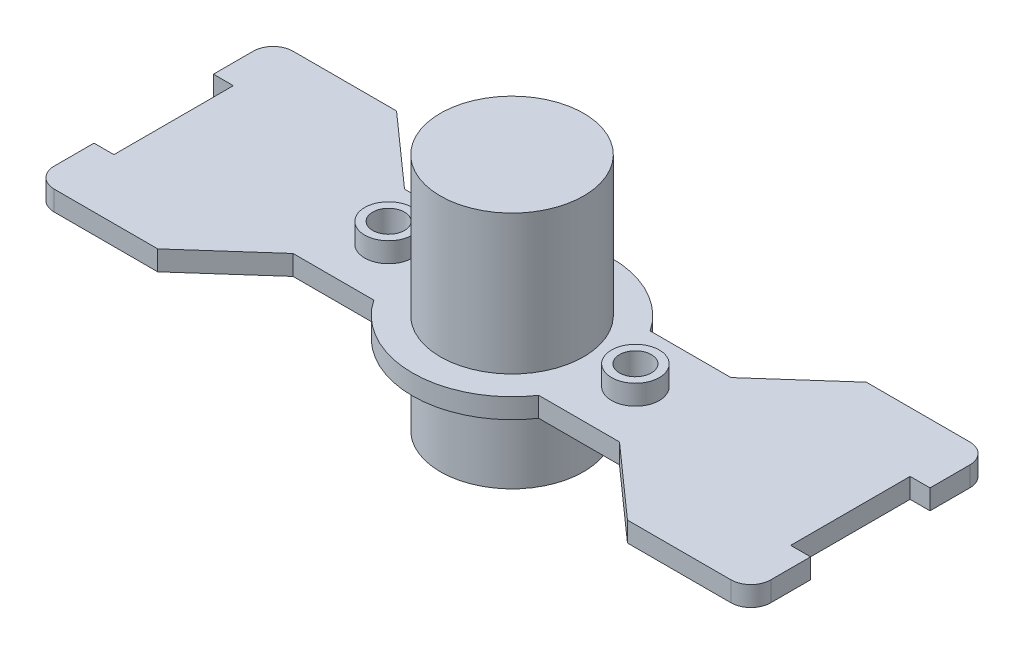
ISO-10303-21;
HEADER;
FILE_DESCRIPTION(('STEP AP214'),'2;1');
FILE_NAME('part.step','',(''),(''),'','','');
FILE_SCHEMA(('AUTOMOTIVE_DESIGN { 1 0 10303 214 1 1 1 1 }'));
ENDSEC;
DATA;
#1=APPLICATION_CONTEXT('core data for automotive mechanical design processes');
#2=APPLICATION_PROTOCOL_DEFINITION('international standard','automotive_design',2000,#1);
#3=PRODUCT_CONTEXT('',#1,'mechanical');
#4=PRODUCT('Part','Part','',(#3));
#5=PRODUCT_RELATED_PRODUCT_CATEGORY('part','',(#4));
#6=PRODUCT_DEFINITION_FORMATION('','',#4);
#7=PRODUCT_DEFINITION_CONTEXT('part definition',#1,'design');
#8=PRODUCT_DEFINITION('design','',#6,#7);
#9=PRODUCT_DEFINITION_SHAPE('','',#8);
#10=(LENGTH_UNIT() NAMED_UNIT(*) SI_UNIT(.MILLI.,.METRE.));
#11=(NAMED_UNIT(*) PLANE_ANGLE_UNIT() SI_UNIT($,.RADIAN.));
#12=(NAMED_UNIT(*) SI_UNIT($,.STERADIAN.) SOLID_ANGLE_UNIT());
#13=UNCERTAINTY_MEASURE_WITH_UNIT(LENGTH_MEASURE(1.E-05),#10,'distance_accuracy_value','');
#14=(GEOMETRIC_REPRESENTATION_CONTEXT(3) GLOBAL_UNCERTAINTY_ASSIGNED_CONTEXT((#13)) GLOBAL_UNIT_ASSIGNED_CONTEXT((#10,
#11,#12)) REPRESENTATION_CONTEXT('',''));
#15=CARTESIAN_POINT('',(0.,0.,0.));
#16=DIRECTION('',(0.,0.,1.));
#17=DIRECTION('',(1.,0.,0.));
#18=AXIS2_PLACEMENT_3D('',#15,#16,#17);
#19=CARTESIAN_POINT('',(-90.,5.,-30.));
#20=DIRECTION('',(1.,0.,0.));
#21=DIRECTION('',(0.,0.,-1.));
#22=AXIS2_PLACEMENT_3D('',#19,#20,#21);
#23=PLANE('',#22);
#24=DIRECTION('',(0.,0.,1.));
#25=VECTOR('',#24,1.);
#26=CARTESIAN_POINT('',(-90.,5.,-30.));
#27=LINE('',#26,#25);
#28=CARTESIAN_POINT('',(-90.,5.,-25.));
#29=VERTEX_POINT('',#28);
#30=CARTESIAN_POINT('',(-90.,5.,-15.));
#31=VERTEX_POINT('',#30);
#32=EDGE_CURVE('E219',#29,#31,#27,.T.);
#33=ORIENTED_EDGE('',*,*,#32,.F.);
#34=DIRECTION('',(0.,-1.,0.));
#35=VECTOR('',#34,1.);
#36=CARTESIAN_POINT('',(-90.,5.,-25.));
#37=LINE('',#36,#35);
#38=CARTESIAN_POINT('',(-90.,0.,-25.));
#39=VERTEX_POINT('',#38);
#40=EDGE_CURVE('E43',#29,#39,#37,.T.);
#41=ORIENTED_EDGE('',*,*,#40,.T.);
#42=DIRECTION('',(0.,0.,1.));
#43=VECTOR('',#42,1.);
#44=CARTESIAN_POINT('',(-90.,0.,-30.));
#45=LINE('',#44,#43);
#46=CARTESIAN_POINT('',(-90.,0.,-15.));
#47=VERTEX_POINT('',#46);
#48=EDGE_CURVE('E243',#39,#47,#45,.T.);
#49=ORIENTED_EDGE('',*,*,#48,.T.);
#50=DIRECTION('',(0.,-1.,0.));
#51=VECTOR('',#50,1.);
#52=CARTESIAN_POINT('',(-90.,5.,-15.));
#53=LINE('',#52,#51);
#54=EDGE_CURVE('E236',#31,#47,#53,.T.);
#55=ORIENTED_EDGE('',*,*,#54,.F.);
#56=EDGE_LOOP('',(#33,#41,#49,#55));
#57=FACE_BOUND('',#56,.T.);
#58=ADVANCED_FACE('F35',(#57),#23,.F.);
#59=CARTESIAN_POINT('',(-90.,5.,-15.));
#60=DIRECTION('',(0.,0.,-1.));
#61=DIRECTION('',(-1.,0.,0.));
#62=AXIS2_PLACEMENT_3D('',#59,#60,#61);
#63=PLANE('',#62);
#64=DIRECTION('',(1.,0.,0.));
#65=VECTOR('',#64,1.);
#66=CARTESIAN_POINT('',(-90.,0.,-15.));
#67=LINE('',#66,#65);
#68=CARTESIAN_POINT('',(-85.,0.,-15.));
#69=VERTEX_POINT('',#68);
#70=EDGE_CURVE('E298',#47,#69,#67,.T.);
#71=ORIENTED_EDGE('',*,*,#70,.T.);
#72=DIRECTION('',(0.,-1.,0.));
#73=VECTOR('',#72,1.);
#74=CARTESIAN_POINT('',(-85.,5.,-15.));
#75=LINE('',#74,#73);
#76=CARTESIAN_POINT('',(-85.,5.,-15.));
#77=VERTEX_POINT('',#76);
#78=EDGE_CURVE('E238',#77,#69,#75,.T.);
#79=ORIENTED_EDGE('',*,*,#78,.F.);
#80=DIRECTION('',(1.,0.,0.));
#81=VECTOR('',#80,1.);
#82=CARTESIAN_POINT('',(-90.,5.,-15.));
#83=LINE('',#82,#81);
#84=EDGE_CURVE('E223',#31,#77,#83,.T.);
#85=ORIENTED_EDGE('',*,*,#84,.F.);
#86=ORIENTED_EDGE('',*,*,#54,.T.);
#87=EDGE_LOOP('',(#71,#79,#85,#86));
#88=FACE_BOUND('',#87,.T.);
#89=ADVANCED_FACE('F235',(#88),#63,.F.);
#90=CARTESIAN_POINT('',(-85.,5.,-15.));
#91=DIRECTION('',(1.,0.,0.));
#92=DIRECTION('',(0.,0.,-1.));
#93=AXIS2_PLACEMENT_3D('',#90,#91,#92);
#94=PLANE('',#93);
#95=DIRECTION('',(0.,0.,1.));
#96=VECTOR('',#95,1.);
#97=CARTESIAN_POINT('',(-85.,0.,-15.));
#98=LINE('',#97,#96);
#99=CARTESIAN_POINT('',(-85.,0.,15.));
#100=VERTEX_POINT('',#99);
#101=EDGE_CURVE('E300',#69,#100,#98,.T.);
#102=ORIENTED_EDGE('',*,*,#101,.T.);
#103=DIRECTION('',(0.,-1.,0.));
#104=VECTOR('',#103,1.);
#105=CARTESIAN_POINT('',(-85.,5.,15.));
#106=LINE('',#105,#104);
#107=CARTESIAN_POINT('',(-85.,5.,15.));
#108=VERTEX_POINT('',#107);
#109=EDGE_CURVE('E250',#108,#100,#106,.T.);
#110=ORIENTED_EDGE('',*,*,#109,.F.);
#111=DIRECTION('',(0.,0.,1.));
#112=VECTOR('',#111,1.);
#113=CARTESIAN_POINT('',(-85.,5.,-15.));
#114=LINE('',#113,#112);
#115=EDGE_CURVE('E240',#77,#108,#114,.T.);
#116=ORIENTED_EDGE('',*,*,#115,.F.);
#117=ORIENTED_EDGE('',*,*,#78,.T.);
#118=EDGE_LOOP('',(#102,#110,#116,#117));
#119=FACE_BOUND('',#118,.T.);
#120=ADVANCED_FACE('F478',(#119),#94,.F.);
#121=CARTESIAN_POINT('',(-85.,5.,15.));
#122=DIRECTION('',(0.,0.,1.));
#123=DIRECTION('',(1.,0.,0.));
#124=AXIS2_PLACEMENT_3D('',#121,#122,#123);
#125=PLANE('',#124);
#126=DIRECTION('',(-1.,0.,0.));
#127=VECTOR('',#126,1.);
#128=CARTESIAN_POINT('',(-85.,0.,15.));
#129=LINE('',#128,#127);
#130=CARTESIAN_POINT('',(-90.,0.,15.));
#131=VERTEX_POINT('',#130);
#132=EDGE_CURVE('E307',#100,#131,#129,.T.);
#133=ORIENTED_EDGE('',*,*,#132,.T.);
#134=DIRECTION('',(0.,-1.,0.));
#135=VECTOR('',#134,1.);
#136=CARTESIAN_POINT('',(-90.,5.,15.));
#137=LINE('',#136,#135);
#138=CARTESIAN_POINT('',(-90.,5.,15.));
#139=VERTEX_POINT('',#138);
#140=EDGE_CURVE('E399',#139,#131,#137,.T.);
#141=ORIENTED_EDGE('',*,*,#140,.F.);
#142=DIRECTION('',(-1.,0.,0.));
#143=VECTOR('',#142,1.);
#144=CARTESIAN_POINT('',(-85.,5.,15.));
#145=LINE('',#144,#143);
#146=EDGE_CURVE('E408',#108,#139,#145,.T.);
#147=ORIENTED_EDGE('',*,*,#146,.F.);
#148=ORIENTED_EDGE('',*,*,#109,.T.);
#149=EDGE_LOOP('',(#133,#141,#147,#148));
#150=FACE_BOUND('',#149,.T.);
#151=ADVANCED_FACE('F406',(#150),#125,.F.);
#152=CARTESIAN_POINT('',(-90.,5.,15.));
#153=DIRECTION('',(1.,0.,0.));
#154=DIRECTION('',(0.,0.,-1.));
#155=AXIS2_PLACEMENT_3D('',#152,#153,#154);
#156=PLANE('',#155);
#157=DIRECTION('',(0.,0.,1.));
#158=VECTOR('',#157,1.);
#159=CARTESIAN_POINT('',(-90.,0.,15.));
#160=LINE('',#159,#158);
#161=CARTESIAN_POINT('',(-90.,0.,25.));
#162=VERTEX_POINT('',#161);
#163=EDGE_CURVE('E309',#131,#162,#160,.T.);
#164=ORIENTED_EDGE('',*,*,#163,.T.);
#165=DIRECTION('',(0.,-1.,0.));
#166=VECTOR('',#165,1.);
#167=CARTESIAN_POINT('',(-90.,5.,25.));
#168=LINE('',#167,#166);
#169=CARTESIAN_POINT('',(-90.,5.,25.));
#170=VERTEX_POINT('',#169);
#171=EDGE_CURVE('E291',#162,#170,#168,.F.);
#172=ORIENTED_EDGE('',*,*,#171,.T.);
#173=DIRECTION('',(0.,0.,1.));
#174=VECTOR('',#173,1.);
#175=CARTESIAN_POINT('',(-90.,5.,15.));
#176=LINE('',#175,#174);
#177=EDGE_CURVE('E424',#139,#170,#176,.T.);
#178=ORIENTED_EDGE('',*,*,#177,.F.);
#179=ORIENTED_EDGE('',*,*,#140,.T.);
#180=EDGE_LOOP('',(#164,#172,#178,#179));
#181=FACE_BOUND('',#180,.T.);
#182=ADVANCED_FACE('F414',(#181),#156,.F.);
#183=CARTESIAN_POINT('',(-90.,5.,30.));
#184=DIRECTION('',(0.,0.,-1.));
#185=DIRECTION('',(-1.,0.,0.));
#186=AXIS2_PLACEMENT_3D('',#183,#184,#185);
#187=PLANE('',#186);
#188=DIRECTION('',(1.,0.,0.));
#189=VECTOR('',#188,1.);
#190=CARTESIAN_POINT('',(-90.,5.,30.));
#191=LINE('',#190,#189);
#192=CARTESIAN_POINT('',(-85.,5.,30.));
#193=VERTEX_POINT('',#192);
#194=CARTESIAN_POINT('',(-59.,5.,30.));
#195=VERTEX_POINT('',#194);
#196=EDGE_CURVE('E422',#193,#195,#191,.T.);
#197=ORIENTED_EDGE('',*,*,#196,.F.);
#198=DIRECTION('',(0.,-1.,0.));
#199=VECTOR('',#198,1.);
#200=CARTESIAN_POINT('',(-85.,5.,30.));
#201=LINE('',#200,#199);
#202=CARTESIAN_POINT('',(-85.,0.,30.));
#203=VERTEX_POINT('',#202);
#204=EDGE_CURVE('E288',#193,#203,#201,.T.);
#205=ORIENTED_EDGE('',*,*,#204,.T.);
#206=DIRECTION('',(1.,0.,0.));
#207=VECTOR('',#206,1.);
#208=CARTESIAN_POINT('',(-90.,0.,30.));
#209=LINE('',#208,#207);
#210=CARTESIAN_POINT('',(-59.,0.,30.));
#211=VERTEX_POINT('',#210);
#212=EDGE_CURVE('E312',#203,#211,#209,.T.);
#213=ORIENTED_EDGE('',*,*,#212,.T.);
#214=DIRECTION('',(0.,-1.,0.));
#215=VECTOR('',#214,1.);
#216=CARTESIAN_POINT('',(-59.,5.,30.));
#217=LINE('',#216,#215);
#218=EDGE_CURVE('E396',#195,#211,#217,.T.);
#219=ORIENTED_EDGE('',*,*,#218,.F.);
#220=EDGE_LOOP('',(#197,#205,#213,#219));
#221=FACE_BOUND('',#220,.T.);
#222=ADVANCED_FACE('F426',(#221),#187,.F.);
#223=CARTESIAN_POINT('',(-59.,5.,30.));
#224=DIRECTION('',(-0.66436383882992,0.,-0.74740931868366));
#225=DIRECTION('',(-0.74740931868366,0.,0.66436383882992));
#226=AXIS2_PLACEMENT_3D('',#223,#224,#225);
#227=PLANE('',#226);
#228=DIRECTION('',(0.74740931868366,0.,-0.66436383882992));
#229=VECTOR('',#228,1.);
#230=CARTESIAN_POINT('',(-59.,0.,30.));
#231=LINE('',#230,#229);
#232=CARTESIAN_POINT('',(-41.,0.,14.));
#233=VERTEX_POINT('',#232);
#234=EDGE_CURVE('E314',#211,#233,#231,.T.);
#235=ORIENTED_EDGE('',*,*,#234,.T.);
#236=DIRECTION('',(0.,-1.,0.));
#237=VECTOR('',#236,1.);
#238=CARTESIAN_POINT('',(-41.,5.,14.));
#239=LINE('',#238,#237);
#240=CARTESIAN_POINT('',(-41.,5.,14.));
#241=VERTEX_POINT('',#240);
#242=EDGE_CURVE('E393',#241,#233,#239,.T.);
#243=ORIENTED_EDGE('',*,*,#242,.F.);
#244=DIRECTION('',(0.74740931868366,0.,-0.66436383882992));
#245=VECTOR('',#244,1.);
#246=CARTESIAN_POINT('',(-59.,5.,30.));
#247=LINE('',#246,#245);
#248=EDGE_CURVE('E428',#195,#241,#247,.T.);
#249=ORIENTED_EDGE('',*,*,#248,.F.);
#250=ORIENTED_EDGE('',*,*,#218,.T.);
#251=EDGE_LOOP('',(#235,#243,#249,#250));
#252=FACE_BOUND('',#251,.T.);
#253=ADVANCED_FACE('F598',(#252),#227,.F.);
#254=CARTESIAN_POINT('',(-41.,5.,14.));
#255=DIRECTION('',(0.,0.,-1.));
#256=DIRECTION('',(-1.,0.,0.));
#257=AXIS2_PLACEMENT_3D('',#254,#255,#256);
#258=PLANE('',#257);
#259=DIRECTION('',(1.,0.,0.));
#260=VECTOR('',#259,1.);
#261=CARTESIAN_POINT('',(-41.,0.,14.));
#262=LINE('',#261,#260);
#263=CARTESIAN_POINT('',(-20.712315177208,0.,14.));
#264=VERTEX_POINT('',#263);
#265=EDGE_CURVE('E316',#233,#264,#262,.T.);
#266=ORIENTED_EDGE('',*,*,#265,.T.);
#267=DIRECTION('',(0.,-1.,0.));
#268=VECTOR('',#267,1.);
#269=CARTESIAN_POINT('',(-20.712315177208,5.,14.));
#270=LINE('',#269,#268);
#271=CARTESIAN_POINT('',(-20.712315177208,5.,14.));
#272=VERTEX_POINT('',#271);
#273=EDGE_CURVE('E390',#272,#264,#270,.T.);
#274=ORIENTED_EDGE('',*,*,#273,.F.);
#275=DIRECTION('',(1.,0.,0.));
#276=VECTOR('',#275,1.);
#277=CARTESIAN_POINT('',(-41.,5.,14.));
#278=LINE('',#277,#276);
#279=EDGE_CURVE('E430',#241,#272,#278,.T.);
#280=ORIENTED_EDGE('',*,*,#279,.F.);
#281=ORIENTED_EDGE('',*,*,#242,.T.);
#282=EDGE_LOOP('',(#266,#274,#280,#281));
#283=FACE_BOUND('',#282,.T.);
#284=ADVANCED_FACE('F594',(#283),#258,.F.);
#285=CARTESIAN_POINT('',(0.,5.,0.));
#286=DIRECTION('',(0.,-1.,0.));
#287=DIRECTION('',(0.,0.,-1.));
#288=AXIS2_PLACEMENT_3D('',#285,#286,#287);
#289=CYLINDRICAL_SURFACE('',#288,25.);
#290=CARTESIAN_POINT('',(0.,0.,0.));
#291=DIRECTION('',(0.,1.,0.));
#292=DIRECTION('',(0.,0.,1.));
#293=AXIS2_PLACEMENT_3D('',#290,#291,#292);
#294=CIRCLE('',#293,25.);
#295=CARTESIAN_POINT('',(20.712315177208,0.,14.));
#296=VERTEX_POINT('',#295);
#297=EDGE_CURVE('E318',#264,#296,#294,.T.);
#298=ORIENTED_EDGE('',*,*,#297,.T.);
#299=DIRECTION('',(0.,-1.,0.));
#300=VECTOR('',#299,1.);
#301=CARTESIAN_POINT('',(20.712315177208,5.,14.));
#302=LINE('',#301,#300);
#303=CARTESIAN_POINT('',(20.712315177208,5.,14.));
#304=VERTEX_POINT('',#303);
#305=EDGE_CURVE('E387',#304,#296,#302,.T.);
#306=ORIENTED_EDGE('',*,*,#305,.F.);
#307=CARTESIAN_POINT('',(0.,5.,0.));
#308=DIRECTION('',(0.,1.,0.));
#309=DIRECTION('',(0.,0.,1.));
#310=AXIS2_PLACEMENT_3D('',#307,#308,#309);
#311=CIRCLE('',#310,25.);
#312=EDGE_CURVE('E436',#272,#304,#311,.T.);
#313=ORIENTED_EDGE('',*,*,#312,.F.);
#314=ORIENTED_EDGE('',*,*,#273,.T.);
#315=EDGE_LOOP('',(#298,#306,#313,#314));
#316=FACE_BOUND('',#315,.T.);
#317=ADVANCED_FACE('F590',(#316),#289,.T.);
#318=CARTESIAN_POINT('',(41.,5.,14.));
#319=DIRECTION('',(0.,0.,-1.));
#320=DIRECTION('',(-1.,0.,0.));
#321=AXIS2_PLACEMENT_3D('',#318,#319,#320);
#322=PLANE('',#321);
#323=DIRECTION('',(1.,0.,0.));
#324=VECTOR('',#323,1.);
#325=CARTESIAN_POINT('',(41.,0.,14.));
#326=LINE('',#325,#324);
#327=CARTESIAN_POINT('',(41.,0.,14.));
#328=VERTEX_POINT('',#327);
#329=EDGE_CURVE('E320',#296,#328,#326,.T.);
#330=ORIENTED_EDGE('',*,*,#329,.T.);
#331=DIRECTION('',(0.,-1.,0.));
#332=VECTOR('',#331,1.);
#333=CARTESIAN_POINT('',(41.,5.,14.));
#334=LINE('',#333,#332);
#335=CARTESIAN_POINT('',(41.,5.,14.));
#336=VERTEX_POINT('',#335);
#337=EDGE_CURVE('E384',#336,#328,#334,.T.);
#338=ORIENTED_EDGE('',*,*,#337,.F.);
#339=DIRECTION('',(1.,0.,0.));
#340=VECTOR('',#339,1.);
#341=CARTESIAN_POINT('',(41.,5.,14.));
#342=LINE('',#341,#340);
#343=EDGE_CURVE('E438',#304,#336,#342,.T.);
#344=ORIENTED_EDGE('',*,*,#343,.F.);
#345=ORIENTED_EDGE('',*,*,#305,.T.);
#346=EDGE_LOOP('',(#330,#338,#344,#345));
#347=FACE_BOUND('',#346,.T.);
#348=ADVANCED_FACE('F586',(#347),#322,.F.);
#349=CARTESIAN_POINT('',(59.,5.,30.));
#350=DIRECTION('',(0.66436383882992,0.,-0.74740931868366));
#351=DIRECTION('',(-0.74740931868366,0.,-0.66436383882992));
#352=AXIS2_PLACEMENT_3D('',#349,#350,#351);
#353=PLANE('',#352);
#354=DIRECTION('',(0.74740931868366,0.,0.66436383882992));
#355=VECTOR('',#354,1.);
#356=CARTESIAN_POINT('',(59.,0.,30.));
#357=LINE('',#356,#355);
#358=CARTESIAN_POINT('',(59.,0.,30.));
#359=VERTEX_POINT('',#358);
#360=EDGE_CURVE('E322',#328,#359,#357,.T.);
#361=ORIENTED_EDGE('',*,*,#360,.T.);
#362=DIRECTION('',(0.,-1.,0.));
#363=VECTOR('',#362,1.);
#364=CARTESIAN_POINT('',(59.,5.,30.));
#365=LINE('',#364,#363);
#366=CARTESIAN_POINT('',(59.,5.,30.));
#367=VERTEX_POINT('',#366);
#368=EDGE_CURVE('E381',#367,#359,#365,.T.);
#369=ORIENTED_EDGE('',*,*,#368,.F.);
#370=DIRECTION('',(0.74740931868366,0.,0.66436383882992));
#371=VECTOR('',#370,1.);
#372=CARTESIAN_POINT('',(59.,5.,30.));
#373=LINE('',#372,#371);
#374=EDGE_CURVE('E440',#336,#367,#373,.T.);
#375=ORIENTED_EDGE('',*,*,#374,.F.);
#376=ORIENTED_EDGE('',*,*,#337,.T.);
#377=EDGE_LOOP('',(#361,#369,#375,#376));
#378=FACE_BOUND('',#377,.T.);
#379=ADVANCED_FACE('F582',(#378),#353,.F.);
#380=CARTESIAN_POINT('',(90.,5.,30.));
#381=DIRECTION('',(0.,0.,-1.));
#382=DIRECTION('',(-1.,0.,0.));
#383=AXIS2_PLACEMENT_3D('',#380,#381,#382);
#384=PLANE('',#383);
#385=DIRECTION('',(1.,0.,0.));
#386=VECTOR('',#385,1.);
#387=CARTESIAN_POINT('',(90.,0.,30.));
#388=LINE('',#387,#386);
#389=CARTESIAN_POINT('',(85.,0.,30.));
#390=VERTEX_POINT('',#389);
#391=EDGE_CURVE('E324',#359,#390,#388,.T.);
#392=ORIENTED_EDGE('',*,*,#391,.T.);
#393=DIRECTION('',(0.,-1.,0.));
#394=VECTOR('',#393,1.);
#395=CARTESIAN_POINT('',(85.,5.,30.));
#396=LINE('',#395,#394);
#397=CARTESIAN_POINT('',(85.,5.,30.));
#398=VERTEX_POINT('',#397);
#399=EDGE_CURVE('E286',#390,#398,#396,.F.);
#400=ORIENTED_EDGE('',*,*,#399,.T.);
#401=DIRECTION('',(1.,0.,0.));
#402=VECTOR('',#401,1.);
#403=CARTESIAN_POINT('',(90.,5.,30.));
#404=LINE('',#403,#402);
#405=EDGE_CURVE('E442',#367,#398,#404,.T.);
#406=ORIENTED_EDGE('',*,*,#405,.F.);
#407=ORIENTED_EDGE('',*,*,#368,.T.);
#408=EDGE_LOOP('',(#392,#400,#406,#407));
#409=FACE_BOUND('',#408,.T.);
#410=ADVANCED_FACE('F579',(#409),#384,.F.);
#411=CARTESIAN_POINT('',(90.,5.,15.));
#412=DIRECTION('',(-1.,0.,0.));
#413=DIRECTION('',(0.,0.,1.));
#414=AXIS2_PLACEMENT_3D('',#411,#412,#413);
#415=PLANE('',#414);
#416=DIRECTION('',(0.,0.,-1.));
#417=VECTOR('',#416,1.);
#418=CARTESIAN_POINT('',(90.,5.,15.));
#419=LINE('',#418,#417);
#420=CARTESIAN_POINT('',(90.,5.,25.));
#421=VERTEX_POINT('',#420);
#422=CARTESIAN_POINT('',(90.,5.,15.));
#423=VERTEX_POINT('',#422);
#424=EDGE_CURVE('E444',#421,#423,#419,.T.);
#425=ORIENTED_EDGE('',*,*,#424,.F.);
#426=DIRECTION('',(0.,-1.,0.));
#427=VECTOR('',#426,1.);
#428=CARTESIAN_POINT('',(90.,5.,25.));
#429=LINE('',#428,#427);
#430=CARTESIAN_POINT('',(90.,0.,25.));
#431=VERTEX_POINT('',#430);
#432=EDGE_CURVE('E283',#421,#431,#429,.T.);
#433=ORIENTED_EDGE('',*,*,#432,.T.);
#434=DIRECTION('',(0.,0.,-1.));
#435=VECTOR('',#434,1.);
#436=CARTESIAN_POINT('',(90.,0.,15.));
#437=LINE('',#436,#435);
#438=CARTESIAN_POINT('',(90.,0.,15.));
#439=VERTEX_POINT('',#438);
#440=EDGE_CURVE('E327',#431,#439,#437,.T.);
#441=ORIENTED_EDGE('',*,*,#440,.T.);
#442=DIRECTION('',(0.,-1.,0.));
#443=VECTOR('',#442,1.);
#444=CARTESIAN_POINT('',(90.,5.,15.));
#445=LINE('',#444,#443);
#446=EDGE_CURVE('E378',#423,#439,#445,.T.);
#447=ORIENTED_EDGE('',*,*,#446,.F.);
#448=EDGE_LOOP('',(#425,#433,#441,#447));
#449=FACE_BOUND('',#448,.T.);
#450=ADVANCED_FACE('F495',(#449),#415,.F.);
#451=CARTESIAN_POINT('',(85.,5.,15.));
#452=DIRECTION('',(0.,0.,1.));
#453=DIRECTION('',(1.,0.,0.));
#454=AXIS2_PLACEMENT_3D('',#451,#452,#453);
#455=PLANE('',#454);
#456=DIRECTION('',(-1.,0.,0.));
#457=VECTOR('',#456,1.);
#458=CARTESIAN_POINT('',(85.,0.,15.));
#459=LINE('',#458,#457);
#460=CARTESIAN_POINT('',(85.,0.,15.));
#461=VERTEX_POINT('',#460);
#462=EDGE_CURVE('E329',#439,#461,#459,.T.);
#463=ORIENTED_EDGE('',*,*,#462,.T.);
#464=DIRECTION('',(0.,-1.,0.));
#465=VECTOR('',#464,1.);
#466=CARTESIAN_POINT('',(85.,5.,15.));
#467=LINE('',#466,#465);
#468=CARTESIAN_POINT('',(85.,5.,15.));
#469=VERTEX_POINT('',#468);
#470=EDGE_CURVE('E375',#469,#461,#467,.T.);
#471=ORIENTED_EDGE('',*,*,#470,.F.);
#472=DIRECTION('',(-1.,0.,0.));
#473=VECTOR('',#472,1.);
#474=CARTESIAN_POINT('',(85.,5.,15.));
#475=LINE('',#474,#473);
#476=EDGE_CURVE('E446',#423,#469,#475,.T.);
#477=ORIENTED_EDGE('',*,*,#476,.F.);
#478=ORIENTED_EDGE('',*,*,#446,.T.);
#479=EDGE_LOOP('',(#463,#471,#477,#478));
#480=FACE_BOUND('',#479,.T.);
#481=ADVANCED_FACE('F503',(#480),#455,.F.);
#482=CARTESIAN_POINT('',(85.,5.,-15.));
#483=DIRECTION('',(-1.,0.,0.));
#484=DIRECTION('',(0.,0.,1.));
#485=AXIS2_PLACEMENT_3D('',#482,#483,#484);
#486=PLANE('',#485);
#487=DIRECTION('',(0.,0.,-1.));
#488=VECTOR('',#487,1.);
#489=CARTESIAN_POINT('',(85.,0.,-15.));
#490=LINE('',#489,#488);
#491=CARTESIAN_POINT('',(85.,0.,-15.));
#492=VERTEX_POINT('',#491);
#493=EDGE_CURVE('E331',#461,#492,#490,.T.);
#494=ORIENTED_EDGE('',*,*,#493,.T.);
#495=DIRECTION('',(0.,-1.,0.));
#496=VECTOR('',#495,1.);
#497=CARTESIAN_POINT('',(85.,5.,-15.));
#498=LINE('',#497,#496);
#499=CARTESIAN_POINT('',(85.,5.,-15.));
#500=VERTEX_POINT('',#499);
#501=EDGE_CURVE('E372',#500,#492,#498,.T.);
#502=ORIENTED_EDGE('',*,*,#501,.F.);
#503=DIRECTION('',(0.,0.,-1.));
#504=VECTOR('',#503,1.);
#505=CARTESIAN_POINT('',(85.,5.,-15.));
#506=LINE('',#505,#504);
#507=EDGE_CURVE('E448',#469,#500,#506,.T.);
#508=ORIENTED_EDGE('',*,*,#507,.F.);
#509=ORIENTED_EDGE('',*,*,#470,.T.);
#510=EDGE_LOOP('',(#494,#502,#508,#509));
#511=FACE_BOUND('',#510,.T.);
#512=ADVANCED_FACE('F507',(#511),#486,.F.);
#513=CARTESIAN_POINT('',(90.,5.,-15.));
#514=DIRECTION('',(0.,0.,-1.));
#515=DIRECTION('',(-1.,0.,0.));
#516=AXIS2_PLACEMENT_3D('',#513,#514,#515);
#517=PLANE('',#516);
#518=DIRECTION('',(1.,0.,0.));
#519=VECTOR('',#518,1.);
#520=CARTESIAN_POINT('',(90.,0.,-15.));
#521=LINE('',#520,#519);
#522=CARTESIAN_POINT('',(90.,0.,-15.));
#523=VERTEX_POINT('',#522);
#524=EDGE_CURVE('E333',#492,#523,#521,.T.);
#525=ORIENTED_EDGE('',*,*,#524,.T.);
#526=DIRECTION('',(0.,-1.,0.));
#527=VECTOR('',#526,1.);
#528=CARTESIAN_POINT('',(90.,5.,-15.));
#529=LINE('',#528,#527);
#530=CARTESIAN_POINT('',(90.,5.,-15.));
#531=VERTEX_POINT('',#530);
#532=EDGE_CURVE('E369',#531,#523,#529,.T.);
#533=ORIENTED_EDGE('',*,*,#532,.F.);
#534=DIRECTION('',(1.,0.,0.));
#535=VECTOR('',#534,1.);
#536=CARTESIAN_POINT('',(90.,5.,-15.));
#537=LINE('',#536,#535);
#538=EDGE_CURVE('E450',#500,#531,#537,.T.);
#539=ORIENTED_EDGE('',*,*,#538,.F.);
#540=ORIENTED_EDGE('',*,*,#501,.T.);
#541=EDGE_LOOP('',(#525,#533,#539,#540));
#542=FACE_BOUND('',#541,.T.);
#543=ADVANCED_FACE('F514',(#542),#517,.F.);
#544=CARTESIAN_POINT('',(90.,5.,-30.));
#545=DIRECTION('',(-1.,0.,0.));
#546=DIRECTION('',(0.,0.,1.));
#547=AXIS2_PLACEMENT_3D('',#544,#545,#546);
#548=PLANE('',#547);
#549=DIRECTION('',(0.,0.,-1.));
#550=VECTOR('',#549,1.);
#551=CARTESIAN_POINT('',(90.,0.,-30.));
#552=LINE('',#551,#550);
#553=CARTESIAN_POINT('',(90.,0.,-25.));
#554=VERTEX_POINT('',#553);
#555=EDGE_CURVE('E335',#523,#554,#552,.T.);
#556=ORIENTED_EDGE('',*,*,#555,.T.);
#557=DIRECTION('',(0.,-1.,0.));
#558=VECTOR('',#557,1.);
#559=CARTESIAN_POINT('',(90.,5.,-25.));
#560=LINE('',#559,#558);
#561=CARTESIAN_POINT('',(90.,5.,-25.));
#562=VERTEX_POINT('',#561);
#563=EDGE_CURVE('E275',#554,#562,#560,.F.);
#564=ORIENTED_EDGE('',*,*,#563,.T.);
#565=DIRECTION('',(0.,0.,-1.));
#566=VECTOR('',#565,1.);
#567=CARTESIAN_POINT('',(90.,5.,-30.));
#568=LINE('',#567,#566);
#569=EDGE_CURVE('E452',#531,#562,#568,.T.);
#570=ORIENTED_EDGE('',*,*,#569,.F.);
#571=ORIENTED_EDGE('',*,*,#532,.T.);
#572=EDGE_LOOP('',(#556,#564,#570,#571));
#573=FACE_BOUND('',#572,.T.);
#574=ADVANCED_FACE('F517',(#573),#548,.F.);
#575=CARTESIAN_POINT('',(59.,5.,-30.));
#576=DIRECTION('',(0.,0.,1.));
#577=DIRECTION('',(1.,0.,0.));
#578=AXIS2_PLACEMENT_3D('',#575,#576,#577);
#579=PLANE('',#578);
#580=DIRECTION('',(-1.,0.,0.));
#581=VECTOR('',#580,1.);
#582=CARTESIAN_POINT('',(59.,5.,-30.));
#583=LINE('',#582,#581);
#584=CARTESIAN_POINT('',(85.,5.,-30.));
#585=VERTEX_POINT('',#584);
#586=CARTESIAN_POINT('',(59.,5.,-30.));
#587=VERTEX_POINT('',#586);
#588=EDGE_CURVE('E454',#585,#587,#583,.T.);
#589=ORIENTED_EDGE('',*,*,#588,.F.);
#590=DIRECTION('',(0.,-1.,0.));
#591=VECTOR('',#590,1.);
#592=CARTESIAN_POINT('',(85.,5.,-30.));
#593=LINE('',#592,#591);
#594=CARTESIAN_POINT('',(85.,0.,-30.));
#595=VERTEX_POINT('',#594);
#596=EDGE_CURVE('E248',#585,#595,#593,.T.);
#597=ORIENTED_EDGE('',*,*,#596,.T.);
#598=DIRECTION('',(-1.,0.,0.));
#599=VECTOR('',#598,1.);
#600=CARTESIAN_POINT('',(59.,0.,-30.));
#601=LINE('',#600,#599);
#602=CARTESIAN_POINT('',(59.,0.,-30.));
#603=VERTEX_POINT('',#602);
#604=EDGE_CURVE('E338',#595,#603,#601,.T.);
#605=ORIENTED_EDGE('',*,*,#604,.T.);
#606=DIRECTION('',(0.,-1.,0.));
#607=VECTOR('',#606,1.);
#608=CARTESIAN_POINT('',(59.,5.,-30.));
#609=LINE('',#608,#607);
#610=EDGE_CURVE('E366',#587,#603,#609,.T.);
#611=ORIENTED_EDGE('',*,*,#610,.F.);
#612=EDGE_LOOP('',(#589,#597,#605,#611));
#613=FACE_BOUND('',#612,.T.);
#614=ADVANCED_FACE('F523',(#613),#579,.F.);
#615=CARTESIAN_POINT('',(41.,5.,-14.));
#616=DIRECTION('',(0.66436383882992,0.,0.74740931868366));
#617=DIRECTION('',(0.74740931868366,0.,-0.66436383882992));
#618=AXIS2_PLACEMENT_3D('',#615,#616,#617);
#619=PLANE('',#618);
#620=DIRECTION('',(-0.74740931868366,0.,0.66436383882992));
#621=VECTOR('',#620,1.);
#622=CARTESIAN_POINT('',(41.,0.,-14.));
#623=LINE('',#622,#621);
#624=CARTESIAN_POINT('',(41.,0.,-14.));
#625=VERTEX_POINT('',#624);
#626=EDGE_CURVE('E340',#603,#625,#623,.T.);
#627=ORIENTED_EDGE('',*,*,#626,.T.);
#628=DIRECTION('',(0.,-1.,0.));
#629=VECTOR('',#628,1.);
#630=CARTESIAN_POINT('',(41.,5.,-14.));
#631=LINE('',#630,#629);
#632=CARTESIAN_POINT('',(41.,5.,-14.));
#633=VERTEX_POINT('',#632);
#634=EDGE_CURVE('E363',#633,#625,#631,.T.);
#635=ORIENTED_EDGE('',*,*,#634,.F.);
#636=DIRECTION('',(-0.74740931868366,0.,0.66436383882992));
#637=VECTOR('',#636,1.);
#638=CARTESIAN_POINT('',(41.,5.,-14.));
#639=LINE('',#638,#637);
#640=EDGE_CURVE('E456',#587,#633,#639,.T.);
#641=ORIENTED_EDGE('',*,*,#640,.F.);
#642=ORIENTED_EDGE('',*,*,#610,.T.);
#643=EDGE_LOOP('',(#627,#635,#641,#642));
#644=FACE_BOUND('',#643,.T.);
#645=ADVANCED_FACE('F528',(#644),#619,.F.);
#646=CARTESIAN_POINT('',(20.712315177208,5.,-14.));
#647=DIRECTION('',(0.,0.,1.));
#648=DIRECTION('',(1.,0.,0.));
#649=AXIS2_PLACEMENT_3D('',#646,#647,#648);
#650=PLANE('',#649);
#651=DIRECTION('',(-1.,0.,0.));
#652=VECTOR('',#651,1.);
#653=CARTESIAN_POINT('',(20.712315177208,0.,-14.));
#654=LINE('',#653,#652);
#655=CARTESIAN_POINT('',(20.712315177208,0.,-14.));
#656=VERTEX_POINT('',#655);
#657=EDGE_CURVE('E342',#625,#656,#654,.T.);
#658=ORIENTED_EDGE('',*,*,#657,.T.);
#659=DIRECTION('',(0.,-1.,0.));
#660=VECTOR('',#659,1.);
#661=CARTESIAN_POINT('',(20.712315177208,5.,-14.));
#662=LINE('',#661,#660);
#663=CARTESIAN_POINT('',(20.712315177208,5.,-14.));
#664=VERTEX_POINT('',#663);
#665=EDGE_CURVE('E360',#664,#656,#662,.T.);
#666=ORIENTED_EDGE('',*,*,#665,.F.);
#667=DIRECTION('',(-1.,0.,0.));
#668=VECTOR('',#667,1.);
#669=CARTESIAN_POINT('',(20.712315177208,5.,-14.));
#670=LINE('',#669,#668);
#671=EDGE_CURVE('E458',#633,#664,#670,.T.);
#672=ORIENTED_EDGE('',*,*,#671,.F.);
#673=ORIENTED_EDGE('',*,*,#634,.T.);
#674=EDGE_LOOP('',(#658,#666,#672,#673));
#675=FACE_BOUND('',#674,.T.);
#676=ADVANCED_FACE('F534',(#675),#650,.F.);
#677=CARTESIAN_POINT('',(0.,5.,0.));
#678=DIRECTION('',(0.,-1.,0.));
#679=DIRECTION('',(0.,0.,-1.));
#680=AXIS2_PLACEMENT_3D('',#677,#678,#679);
#681=CYLINDRICAL_SURFACE('',#680,25.);
#682=CARTESIAN_POINT('',(0.,0.,0.));
#683=DIRECTION('',(0.,1.,0.));
#684=DIRECTION('',(0.,0.,1.));
#685=AXIS2_PLACEMENT_3D('',#682,#683,#684);
#686=CIRCLE('',#685,25.);
#687=CARTESIAN_POINT('',(-20.712315177208,0.,-14.));
#688=VERTEX_POINT('',#687);
#689=EDGE_CURVE('E344',#656,#688,#686,.T.);
#690=ORIENTED_EDGE('',*,*,#689,.T.);
#691=DIRECTION('',(0.,-1.,0.));
#692=VECTOR('',#691,1.);
#693=CARTESIAN_POINT('',(-20.712315177208,5.,-14.));
#694=LINE('',#693,#692);
#695=CARTESIAN_POINT('',(-20.712315177208,5.,-14.));
#696=VERTEX_POINT('',#695);
#697=EDGE_CURVE('E357',#696,#688,#694,.T.);
#698=ORIENTED_EDGE('',*,*,#697,.F.);
#699=CARTESIAN_POINT('',(0.,5.,0.));
#700=DIRECTION('',(0.,1.,0.));
#701=DIRECTION('',(0.,0.,1.));
#702=AXIS2_PLACEMENT_3D('',#699,#700,#701);
#703=CIRCLE('',#702,25.);
#704=EDGE_CURVE('E460',#664,#696,#703,.T.);
#705=ORIENTED_EDGE('',*,*,#704,.F.);
#706=ORIENTED_EDGE('',*,*,#665,.T.);
#707=EDGE_LOOP('',(#690,#698,#705,#706));
#708=FACE_BOUND('',#707,.T.);
#709=ADVANCED_FACE('F538',(#708),#681,.T.);
#710=CARTESIAN_POINT('',(-20.712315177208,5.,-14.));
#711=DIRECTION('',(0.,0.,1.));
#712=DIRECTION('',(1.,0.,0.));
#713=AXIS2_PLACEMENT_3D('',#710,#711,#712);
#714=PLANE('',#713);
#715=DIRECTION('',(-1.,0.,0.));
#716=VECTOR('',#715,1.);
#717=CARTESIAN_POINT('',(-20.712315177208,0.,-14.));
#718=LINE('',#717,#716);
#719=CARTESIAN_POINT('',(-41.,0.,-14.));
#720=VERTEX_POINT('',#719);
#721=EDGE_CURVE('E346',#688,#720,#718,.T.);
#722=ORIENTED_EDGE('',*,*,#721,.T.);
#723=DIRECTION('',(0.,-1.,0.));
#724=VECTOR('',#723,1.);
#725=CARTESIAN_POINT('',(-41.,5.,-14.));
#726=LINE('',#725,#724);
#727=CARTESIAN_POINT('',(-41.,5.,-14.));
#728=VERTEX_POINT('',#727);
#729=EDGE_CURVE('E354',#728,#720,#726,.T.);
#730=ORIENTED_EDGE('',*,*,#729,.F.);
#731=DIRECTION('',(-1.,0.,0.));
#732=VECTOR('',#731,1.);
#733=CARTESIAN_POINT('',(-20.712315177208,5.,-14.));
#734=LINE('',#733,#732);
#735=EDGE_CURVE('E462',#696,#728,#734,.T.);
#736=ORIENTED_EDGE('',*,*,#735,.F.);
#737=ORIENTED_EDGE('',*,*,#697,.T.);
#738=EDGE_LOOP('',(#722,#730,#736,#737));
#739=FACE_BOUND('',#738,.T.);
#740=ADVANCED_FACE('F543',(#739),#714,.F.);
#741=CARTESIAN_POINT('',(-41.,5.,-14.));
#742=DIRECTION('',(-0.66436383882992,0.,0.74740931868366));
#743=DIRECTION('',(0.74740931868366,0.,0.66436383882992));
#744=AXIS2_PLACEMENT_3D('',#741,#742,#743);
#745=PLANE('',#744);
#746=DIRECTION('',(-0.74740931868366,0.,-0.66436383882992));
#747=VECTOR('',#746,1.);
#748=CARTESIAN_POINT('',(-41.,0.,-14.));
#749=LINE('',#748,#747);
#750=CARTESIAN_POINT('',(-59.,0.,-30.));
#751=VERTEX_POINT('',#750);
#752=EDGE_CURVE('E348',#720,#751,#749,.T.);
#753=ORIENTED_EDGE('',*,*,#752,.T.);
#754=DIRECTION('',(0.,-1.,0.));
#755=VECTOR('',#754,1.);
#756=CARTESIAN_POINT('',(-59.,5.,-30.));
#757=LINE('',#756,#755);
#758=CARTESIAN_POINT('',(-59.,5.,-30.));
#759=VERTEX_POINT('',#758);
#760=EDGE_CURVE('E351',#759,#751,#757,.T.);
#761=ORIENTED_EDGE('',*,*,#760,.F.);
#762=DIRECTION('',(-0.74740931868366,0.,-0.66436383882992));
#763=VECTOR('',#762,1.);
#764=CARTESIAN_POINT('',(-41.,5.,-14.));
#765=LINE('',#764,#763);
#766=EDGE_CURVE('E463',#728,#759,#765,.T.);
#767=ORIENTED_EDGE('',*,*,#766,.F.);
#768=ORIENTED_EDGE('',*,*,#729,.T.);
#769=EDGE_LOOP('',(#753,#761,#767,#768));
#770=FACE_BOUND('',#769,.T.);
#771=ADVANCED_FACE('F546',(#770),#745,.F.);
#772=CARTESIAN_POINT('',(-59.,5.,-30.));
#773=DIRECTION('',(0.,0.,1.));
#774=DIRECTION('',(1.,0.,0.));
#775=AXIS2_PLACEMENT_3D('',#772,#773,#774);
#776=PLANE('',#775);
#777=DIRECTION('',(-1.,0.,0.));
#778=VECTOR('',#777,1.);
#779=CARTESIAN_POINT('',(-59.,0.,-30.));
#780=LINE('',#779,#778);
#781=CARTESIAN_POINT('',(-85.,0.,-30.));
#782=VERTEX_POINT('',#781);
#783=EDGE_CURVE('E231',#751,#782,#780,.T.);
#784=ORIENTED_EDGE('',*,*,#783,.T.);
#785=DIRECTION('',(0.,-1.,0.));
#786=VECTOR('',#785,1.);
#787=CARTESIAN_POINT('',(-85.,5.,-30.));
#788=LINE('',#787,#786);
#789=CARTESIAN_POINT('',(-85.,5.,-30.));
#790=VERTEX_POINT('',#789);
#791=EDGE_CURVE('E11',#782,#790,#788,.F.);
#792=ORIENTED_EDGE('',*,*,#791,.T.);
#793=DIRECTION('',(-1.,0.,0.));
#794=VECTOR('',#793,1.);
#795=CARTESIAN_POINT('',(-59.,5.,-30.));
#796=LINE('',#795,#794);
#797=EDGE_CURVE('E303',#759,#790,#796,.T.);
#798=ORIENTED_EDGE('',*,*,#797,.F.);
#799=ORIENTED_EDGE('',*,*,#760,.T.);
#800=EDGE_LOOP('',(#784,#792,#798,#799));
#801=FACE_BOUND('',#800,.T.);
#802=ADVANCED_FACE('F547',(#801),#776,.F.);
#803=CARTESIAN_POINT('',(0.,5.,0.));
#804=DIRECTION('',(0.,1.,0.));
#805=DIRECTION('',(0.,0.,1.));
#806=AXIS2_PLACEMENT_3D('',#803,#804,#805);
#807=PLANE('',#806);
#808=CARTESIAN_POINT('',(31.,5.,0.));
#809=DIRECTION('',(0.,1.,0.));
#810=DIRECTION('',(0.,0.,1.));
#811=AXIS2_PLACEMENT_3D('',#808,#809,#810);
#812=CIRCLE('',#811,6.);
#813=CARTESIAN_POINT('',(31.,5.,6.));
#814=VERTEX_POINT('',#813);
#815=EDGE_CURVE('E633',#814,#814,#812,.T.);
#816=ORIENTED_EDGE('',*,*,#815,.F.);
#817=EDGE_LOOP('',(#816));
#818=FACE_BOUND('',#817,.T.);
#819=CARTESIAN_POINT('',(-31.,5.,0.));
#820=DIRECTION('',(0.,1.,0.));
#821=DIRECTION('',(0.,0.,1.));
#822=AXIS2_PLACEMENT_3D('',#819,#820,#821);
#823=CIRCLE('',#822,6.);
#824=CARTESIAN_POINT('',(-31.,5.,6.));
#825=VERTEX_POINT('',#824);
#826=EDGE_CURVE('E624',#825,#825,#823,.T.);
#827=ORIENTED_EDGE('',*,*,#826,.F.);
#828=EDGE_LOOP('',(#827));
#829=FACE_BOUND('',#828,.T.);
#830=CARTESIAN_POINT('',(0.,5.,0.));
#831=DIRECTION('',(0.,1.,0.));
#832=DIRECTION('',(0.,0.,1.));
#833=AXIS2_PLACEMENT_3D('',#830,#831,#832);
#834=CIRCLE('',#833,18.);
#835=CARTESIAN_POINT('',(0.,5.,18.));
#836=VERTEX_POINT('',#835);
#837=EDGE_CURVE('E245',#836,#836,#834,.T.);
#838=ORIENTED_EDGE('',*,*,#837,.F.);
#839=EDGE_LOOP('',(#838));
#840=FACE_BOUND('',#839,.T.);
#841=ORIENTED_EDGE('',*,*,#569,.T.);
#842=CARTESIAN_POINT('',(85.,5.,-25.));
#843=DIRECTION('',(0.,1.,0.));
#844=DIRECTION('',(0.,0.,1.));
#845=AXIS2_PLACEMENT_3D('',#842,#843,#844);
#846=CIRCLE('',#845,5.);
#847=EDGE_CURVE('E281',#562,#585,#846,.T.);
#848=ORIENTED_EDGE('',*,*,#847,.T.);
#849=ORIENTED_EDGE('',*,*,#588,.T.);
#850=ORIENTED_EDGE('',*,*,#640,.T.);
#851=ORIENTED_EDGE('',*,*,#671,.T.);
#852=ORIENTED_EDGE('',*,*,#704,.T.);
#853=ORIENTED_EDGE('',*,*,#735,.T.);
#854=ORIENTED_EDGE('',*,*,#766,.T.);
#855=ORIENTED_EDGE('',*,*,#797,.T.);
#856=CARTESIAN_POINT('',(-85.,5.,-25.));
#857=DIRECTION('',(0.,1.,0.));
#858=DIRECTION('',(0.,0.,1.));
#859=AXIS2_PLACEMENT_3D('',#856,#857,#858);
#860=CIRCLE('',#859,5.);
#861=EDGE_CURVE('E226',#790,#29,#860,.T.);
#862=ORIENTED_EDGE('',*,*,#861,.T.);
#863=ORIENTED_EDGE('',*,*,#32,.T.);
#864=ORIENTED_EDGE('',*,*,#84,.T.);
#865=ORIENTED_EDGE('',*,*,#115,.T.);
#866=ORIENTED_EDGE('',*,*,#146,.T.);
#867=ORIENTED_EDGE('',*,*,#177,.T.);
#868=CARTESIAN_POINT('',(-85.,5.,25.));
#869=DIRECTION('',(0.,1.,0.));
#870=DIRECTION('',(0.,0.,1.));
#871=AXIS2_PLACEMENT_3D('',#868,#869,#870);
#872=CIRCLE('',#871,5.);
#873=EDGE_CURVE('E278',#170,#193,#872,.T.);
#874=ORIENTED_EDGE('',*,*,#873,.T.);
#875=ORIENTED_EDGE('',*,*,#196,.T.);
#876=ORIENTED_EDGE('',*,*,#248,.T.);
#877=ORIENTED_EDGE('',*,*,#279,.T.);
#878=ORIENTED_EDGE('',*,*,#312,.T.);
#879=ORIENTED_EDGE('',*,*,#343,.T.);
#880=ORIENTED_EDGE('',*,*,#374,.T.);
#881=ORIENTED_EDGE('',*,*,#405,.T.);
#882=CARTESIAN_POINT('',(85.,5.,25.));
#883=DIRECTION('',(0.,1.,0.));
#884=DIRECTION('',(0.,0.,1.));
#885=AXIS2_PLACEMENT_3D('',#882,#883,#884);
#886=CIRCLE('',#885,5.);
#887=EDGE_CURVE('E56',#398,#421,#886,.T.);
#888=ORIENTED_EDGE('',*,*,#887,.T.);
#889=ORIENTED_EDGE('',*,*,#424,.T.);
#890=ORIENTED_EDGE('',*,*,#476,.T.);
#891=ORIENTED_EDGE('',*,*,#507,.T.);
#892=ORIENTED_EDGE('',*,*,#538,.T.);
#893=EDGE_LOOP('',(#841,#848,#849,#850,#851,#852,#853,#854,#855,#862,#863,#864,#865,#866,#867,
#874,#875,#876,#877,#878,#879,#880,#881,#888,#889,#890,#891,#892));
#894=FACE_BOUND('',#893,.T.);
#895=ADVANCED_FACE('F222',(#818,#829,#840,#894),#807,.T.);
#896=CARTESIAN_POINT('',(0.,0.,0.));
#897=DIRECTION('',(0.,1.,0.));
#898=DIRECTION('',(0.,0.,1.));
#899=AXIS2_PLACEMENT_3D('',#896,#897,#898);
#900=PLANE('',#899);
#901=CARTESIAN_POINT('',(31.,0.,0.));
#902=DIRECTION('',(0.,1.,0.));
#903=DIRECTION('',(0.,0.,1.));
#904=AXIS2_PLACEMENT_3D('',#901,#902,#903);
#905=CIRCLE('',#904,4.);
#906=CARTESIAN_POINT('',(31.,0.,4.));
#907=VERTEX_POINT('',#906);
#908=EDGE_CURVE('E261',#907,#907,#905,.T.);
#909=ORIENTED_EDGE('',*,*,#908,.T.);
#910=EDGE_LOOP('',(#909));
#911=FACE_BOUND('',#910,.T.);
#912=CARTESIAN_POINT('',(-31.,0.,0.));
#913=DIRECTION('',(0.,1.,0.));
#914=DIRECTION('',(0.,0.,1.));
#915=AXIS2_PLACEMENT_3D('',#912,#913,#914);
#916=CIRCLE('',#915,4.);
#917=CARTESIAN_POINT('',(-31.,0.,4.));
#918=VERTEX_POINT('',#917);
#919=EDGE_CURVE('E258',#918,#918,#916,.T.);
#920=ORIENTED_EDGE('',*,*,#919,.T.);
#921=EDGE_LOOP('',(#920));
#922=FACE_BOUND('',#921,.T.);
#923=CARTESIAN_POINT('',(0.,0.,0.));
#924=DIRECTION('',(0.,1.,0.));
#925=DIRECTION('',(0.,0.,1.));
#926=AXIS2_PLACEMENT_3D('',#923,#924,#925);
#927=CIRCLE('',#926,18.);
#928=CARTESIAN_POINT('',(0.,0.,18.));
#929=VERTEX_POINT('',#928);
#930=EDGE_CURVE('E254',#929,#929,#927,.T.);
#931=ORIENTED_EDGE('',*,*,#930,.T.);
#932=EDGE_LOOP('',(#931));
#933=FACE_BOUND('',#932,.T.);
#934=ORIENTED_EDGE('',*,*,#604,.F.);
#935=CARTESIAN_POINT('',(85.,0.,-25.));
#936=DIRECTION('',(0.,1.,0.));
#937=DIRECTION('',(0.,0.,1.));
#938=AXIS2_PLACEMENT_3D('',#935,#936,#937);
#939=CIRCLE('',#938,5.);
#940=EDGE_CURVE('E273',#595,#554,#939,.F.);
#941=ORIENTED_EDGE('',*,*,#940,.T.);
#942=ORIENTED_EDGE('',*,*,#555,.F.);
#943=ORIENTED_EDGE('',*,*,#524,.F.);
#944=ORIENTED_EDGE('',*,*,#493,.F.);
#945=ORIENTED_EDGE('',*,*,#462,.F.);
#946=ORIENTED_EDGE('',*,*,#440,.F.);
#947=CARTESIAN_POINT('',(85.,0.,25.));
#948=DIRECTION('',(0.,1.,0.));
#949=DIRECTION('',(0.,0.,1.));
#950=AXIS2_PLACEMENT_3D('',#947,#948,#949);
#951=CIRCLE('',#950,5.);
#952=EDGE_CURVE('E271',#431,#390,#951,.F.);
#953=ORIENTED_EDGE('',*,*,#952,.T.);
#954=ORIENTED_EDGE('',*,*,#391,.F.);
#955=ORIENTED_EDGE('',*,*,#360,.F.);
#956=ORIENTED_EDGE('',*,*,#329,.F.);
#957=ORIENTED_EDGE('',*,*,#297,.F.);
#958=ORIENTED_EDGE('',*,*,#265,.F.);
#959=ORIENTED_EDGE('',*,*,#234,.F.);
#960=ORIENTED_EDGE('',*,*,#212,.F.);
#961=CARTESIAN_POINT('',(-85.,0.,25.));
#962=DIRECTION('',(0.,1.,0.));
#963=DIRECTION('',(0.,0.,1.));
#964=AXIS2_PLACEMENT_3D('',#961,#962,#963);
#965=CIRCLE('',#964,5.);
#966=EDGE_CURVE('E269',#203,#162,#965,.F.);
#967=ORIENTED_EDGE('',*,*,#966,.T.);
#968=ORIENTED_EDGE('',*,*,#163,.F.);
#969=ORIENTED_EDGE('',*,*,#132,.F.);
#970=ORIENTED_EDGE('',*,*,#101,.F.);
#971=ORIENTED_EDGE('',*,*,#70,.F.);
#972=ORIENTED_EDGE('',*,*,#48,.F.);
#973=CARTESIAN_POINT('',(-85.,0.,-25.));
#974=DIRECTION('',(0.,1.,0.));
#975=DIRECTION('',(0.,0.,1.));
#976=AXIS2_PLACEMENT_3D('',#973,#974,#975);
#977=CIRCLE('',#976,5.);
#978=EDGE_CURVE('E267',#39,#782,#977,.F.);
#979=ORIENTED_EDGE('',*,*,#978,.T.);
#980=ORIENTED_EDGE('',*,*,#783,.F.);
#981=ORIENTED_EDGE('',*,*,#752,.F.);
#982=ORIENTED_EDGE('',*,*,#721,.F.);
#983=ORIENTED_EDGE('',*,*,#689,.F.);
#984=ORIENTED_EDGE('',*,*,#657,.F.);
#985=ORIENTED_EDGE('',*,*,#626,.F.);
#986=EDGE_LOOP('',(#934,#941,#942,#943,#944,#945,#946,#953,#954,#955,#956,#957,#958,#959,#960,
#967,#968,#969,#970,#971,#972,#979,#980,#981,#982,#983,#984,#985));
#987=FACE_BOUND('',#986,.T.);
#988=ADVANCED_FACE('F295',(#911,#922,#933,#987),#900,.F.);
#989=CARTESIAN_POINT('',(0.,-20.,0.));
#990=DIRECTION('',(0.,1.,0.));
#991=DIRECTION('',(0.,0.,1.));
#992=AXIS2_PLACEMENT_3D('',#989,#990,#991);
#993=PLANE('',#992);
#994=CARTESIAN_POINT('',(0.,-20.,0.));
#995=DIRECTION('',(0.,-1.,0.));
#996=DIRECTION('',(0.,0.,-1.));
#997=AXIS2_PLACEMENT_3D('',#994,#995,#996);
#998=CIRCLE('',#997,15.);
#999=CARTESIAN_POINT('',(0.,-20.,-15.));
#1000=VERTEX_POINT('',#999);
#1001=EDGE_CURVE('E618',#1000,#1000,#998,.T.);
#1002=ORIENTED_EDGE('',*,*,#1001,.F.);
#1003=EDGE_LOOP('',(#1002));
#1004=FACE_BOUND('',#1003,.T.);
#1005=CARTESIAN_POINT('',(0.,-20.,0.));
#1006=DIRECTION('',(0.,1.,0.));
#1007=DIRECTION('',(0.,0.,1.));
#1008=AXIS2_PLACEMENT_3D('',#1005,#1006,#1007);
#1009=CIRCLE('',#1008,18.);
#1010=CARTESIAN_POINT('',(0.,-20.,18.));
#1011=VERTEX_POINT('',#1010);
#1012=EDGE_CURVE('E257',#1011,#1011,#1009,.T.);
#1013=ORIENTED_EDGE('',*,*,#1012,.F.);
#1014=EDGE_LOOP('',(#1013));
#1015=FACE_BOUND('',#1014,.T.);
#1016=ADVANCED_FACE('F680',(#1004,#1015),#993,.F.);
#1017=CARTESIAN_POINT('',(0.,-20.,0.));
#1018=DIRECTION('',(0.,1.,0.));
#1019=DIRECTION('',(0.,0.,1.));
#1020=AXIS2_PLACEMENT_3D('',#1017,#1018,#1019);
#1021=CYLINDRICAL_SURFACE('',#1020,18.);
#1022=ORIENTED_EDGE('',*,*,#1012,.T.);
#1023=EDGE_LOOP('',(#1022));
#1024=FACE_BOUND('',#1023,.T.);
#1025=ORIENTED_EDGE('',*,*,#930,.F.);
#1026=EDGE_LOOP('',(#1025));
#1027=FACE_BOUND('',#1026,.T.);
#1028=ADVANCED_FACE('F683',(#1024,#1027),#1021,.T.);
#1029=ORIENTED_EDGE('',*,*,#837,.T.);
#1030=EDGE_LOOP('',(#1029));
#1031=FACE_BOUND('',#1030,.T.);
#1032=CARTESIAN_POINT('',(0.,40.,0.));
#1033=DIRECTION('',(0.,1.,0.));
#1034=DIRECTION('',(0.,0.,1.));
#1035=AXIS2_PLACEMENT_3D('',#1032,#1033,#1034);
#1036=CIRCLE('',#1035,18.);
#1037=CARTESIAN_POINT('',(0.,40.,18.));
#1038=VERTEX_POINT('',#1037);
#1039=EDGE_CURVE('E614',#1038,#1038,#1036,.T.);
#1040=ORIENTED_EDGE('',*,*,#1039,.F.);
#1041=EDGE_LOOP('',(#1040));
#1042=FACE_BOUND('',#1041,.T.);
#1043=ADVANCED_FACE('F678',(#1031,#1042),#1021,.T.);
#1044=CARTESIAN_POINT('',(0.,40.,0.));
#1045=DIRECTION('',(0.,1.,0.));
#1046=DIRECTION('',(0.,0.,1.));
#1047=AXIS2_PLACEMENT_3D('',#1044,#1045,#1046);
#1048=PLANE('',#1047);
#1049=ORIENTED_EDGE('',*,*,#1039,.T.);
#1050=EDGE_LOOP('',(#1049));
#1051=FACE_BOUND('',#1050,.T.);
#1052=ADVANCED_FACE('F674',(#1051),#1048,.T.);
#1053=CARTESIAN_POINT('',(0.,35.,0.));
#1054=DIRECTION('',(0.,-1.,0.));
#1055=DIRECTION('',(0.,0.,-1.));
#1056=AXIS2_PLACEMENT_3D('',#1053,#1054,#1055);
#1057=CYLINDRICAL_SURFACE('',#1056,15.);
#1058=CARTESIAN_POINT('',(0.,35.,0.));
#1059=DIRECTION('',(0.,-1.,0.));
#1060=DIRECTION('',(0.,0.,-1.));
#1061=AXIS2_PLACEMENT_3D('',#1058,#1059,#1060);
#1062=CIRCLE('',#1061,15.);
#1063=CARTESIAN_POINT('',(0.,35.,-15.));
#1064=VERTEX_POINT('',#1063);
#1065=EDGE_CURVE('E617',#1064,#1064,#1062,.T.);
#1066=ORIENTED_EDGE('',*,*,#1065,.F.);
#1067=EDGE_LOOP('',(#1066));
#1068=FACE_BOUND('',#1067,.T.);
#1069=ORIENTED_EDGE('',*,*,#1001,.T.);
#1070=EDGE_LOOP('',(#1069));
#1071=FACE_BOUND('',#1070,.T.);
#1072=ADVANCED_FACE('F670',(#1068,#1071),#1057,.F.);
#1073=CARTESIAN_POINT('',(0.,35.,0.));
#1074=DIRECTION('',(0.,-1.,0.));
#1075=DIRECTION('',(0.,0.,-1.));
#1076=AXIS2_PLACEMENT_3D('',#1073,#1074,#1075);
#1077=PLANE('',#1076);
#1078=ORIENTED_EDGE('',*,*,#1065,.T.);
#1079=EDGE_LOOP('',(#1078));
#1080=FACE_BOUND('',#1079,.T.);
#1081=ADVANCED_FACE('F663',(#1080),#1077,.T.);
#1082=CARTESIAN_POINT('',(-31.,10.,0.));
#1083=DIRECTION('',(0.,1.,0.));
#1084=DIRECTION('',(0.,0.,1.));
#1085=AXIS2_PLACEMENT_3D('',#1082,#1083,#1084);
#1086=PLANE('',#1085);
#1087=CARTESIAN_POINT('',(-31.,10.,0.));
#1088=DIRECTION('',(0.,1.,0.));
#1089=DIRECTION('',(0.,0.,1.));
#1090=AXIS2_PLACEMENT_3D('',#1087,#1088,#1089);
#1091=CIRCLE('',#1090,6.);
#1092=CARTESIAN_POINT('',(-31.,10.,6.));
#1093=VERTEX_POINT('',#1092);
#1094=EDGE_CURVE('E621',#1093,#1093,#1091,.T.);
#1095=ORIENTED_EDGE('',*,*,#1094,.T.);
#1096=EDGE_LOOP('',(#1095));
#1097=FACE_BOUND('',#1096,.T.);
#1098=CARTESIAN_POINT('',(-31.,10.,0.));
#1099=DIRECTION('',(0.,1.,0.));
#1100=DIRECTION('',(0.,0.,1.));
#1101=AXIS2_PLACEMENT_3D('',#1098,#1099,#1100);
#1102=CIRCLE('',#1101,4.);
#1103=CARTESIAN_POINT('',(-31.,10.,4.));
#1104=VERTEX_POINT('',#1103);
#1105=EDGE_CURVE('E627',#1104,#1104,#1102,.T.);
#1106=ORIENTED_EDGE('',*,*,#1105,.F.);
#1107=EDGE_LOOP('',(#1106));
#1108=FACE_BOUND('',#1107,.T.);
#1109=ADVANCED_FACE('F660',(#1097,#1108),#1086,.T.);
#1110=CARTESIAN_POINT('',(-31.,10.,0.));
#1111=DIRECTION('',(0.,-1.,0.));
#1112=DIRECTION('',(0.,0.,-1.));
#1113=AXIS2_PLACEMENT_3D('',#1110,#1111,#1112);
#1114=CYLINDRICAL_SURFACE('',#1113,6.);
#1115=ORIENTED_EDGE('',*,*,#1094,.F.);
#1116=EDGE_LOOP('',(#1115));
#1117=FACE_BOUND('',#1116,.T.);
#1118=ORIENTED_EDGE('',*,*,#826,.T.);
#1119=EDGE_LOOP('',(#1118));
#1120=FACE_BOUND('',#1119,.T.);
#1121=ADVANCED_FACE('F655',(#1117,#1120),#1114,.T.);
#1122=CARTESIAN_POINT('',(-31.,10.,0.));
#1123=DIRECTION('',(0.,-1.,0.));
#1124=DIRECTION('',(0.,0.,-1.));
#1125=AXIS2_PLACEMENT_3D('',#1122,#1123,#1124);
#1126=CYLINDRICAL_SURFACE('',#1125,4.);
#1127=ORIENTED_EDGE('',*,*,#1105,.T.);
#1128=EDGE_LOOP('',(#1127));
#1129=FACE_BOUND('',#1128,.T.);
#1130=ORIENTED_EDGE('',*,*,#919,.F.);
#1131=EDGE_LOOP('',(#1130));
#1132=FACE_BOUND('',#1131,.T.);
#1133=ADVANCED_FACE('F646',(#1129,#1132),#1126,.F.);
#1134=CARTESIAN_POINT('',(31.,10.,0.));
#1135=DIRECTION('',(0.,1.,0.));
#1136=DIRECTION('',(0.,0.,1.));
#1137=AXIS2_PLACEMENT_3D('',#1134,#1135,#1136);
#1138=PLANE('',#1137);
#1139=CARTESIAN_POINT('',(31.,10.,0.));
#1140=DIRECTION('',(0.,1.,0.));
#1141=DIRECTION('',(0.,0.,1.));
#1142=AXIS2_PLACEMENT_3D('',#1139,#1140,#1141);
#1143=CIRCLE('',#1142,6.);
#1144=CARTESIAN_POINT('',(31.,10.,6.));
#1145=VERTEX_POINT('',#1144);
#1146=EDGE_CURVE('E632',#1145,#1145,#1143,.T.);
#1147=ORIENTED_EDGE('',*,*,#1146,.T.);
#1148=EDGE_LOOP('',(#1147));
#1149=FACE_BOUND('',#1148,.T.);
#1150=CARTESIAN_POINT('',(31.,10.,0.));
#1151=DIRECTION('',(0.,1.,0.));
#1152=DIRECTION('',(0.,0.,1.));
#1153=AXIS2_PLACEMENT_3D('',#1150,#1151,#1152);
#1154=CIRCLE('',#1153,4.);
#1155=CARTESIAN_POINT('',(31.,10.,4.));
#1156=VERTEX_POINT('',#1155);
#1157=EDGE_CURVE('E264',#1156,#1156,#1154,.T.);
#1158=ORIENTED_EDGE('',*,*,#1157,.F.);
#1159=EDGE_LOOP('',(#1158));
#1160=FACE_BOUND('',#1159,.T.);
#1161=ADVANCED_FACE('F643',(#1149,#1160),#1138,.T.);
#1162=CARTESIAN_POINT('',(31.,10.,0.));
#1163=DIRECTION('',(0.,-1.,0.));
#1164=DIRECTION('',(0.,0.,-1.));
#1165=AXIS2_PLACEMENT_3D('',#1162,#1163,#1164);
#1166=CYLINDRICAL_SURFACE('',#1165,6.);
#1167=ORIENTED_EDGE('',*,*,#1146,.F.);
#1168=EDGE_LOOP('',(#1167));
#1169=FACE_BOUND('',#1168,.T.);
#1170=ORIENTED_EDGE('',*,*,#815,.T.);
#1171=EDGE_LOOP('',(#1170));
#1172=FACE_BOUND('',#1171,.T.);
#1173=ADVANCED_FACE('F645',(#1169,#1172),#1166,.T.);
#1174=CARTESIAN_POINT('',(31.,10.,0.));
#1175=DIRECTION('',(0.,-1.,0.));
#1176=DIRECTION('',(0.,0.,-1.));
#1177=AXIS2_PLACEMENT_3D('',#1174,#1175,#1176);
#1178=CYLINDRICAL_SURFACE('',#1177,4.);
#1179=ORIENTED_EDGE('',*,*,#1157,.T.);
#1180=EDGE_LOOP('',(#1179));
#1181=FACE_BOUND('',#1180,.T.);
#1182=ORIENTED_EDGE('',*,*,#908,.F.);
#1183=EDGE_LOOP('',(#1182));
#1184=FACE_BOUND('',#1183,.T.);
#1185=ADVANCED_FACE('F485',(#1181,#1184),#1178,.F.);
#1186=CARTESIAN_POINT('',(85.,5.,-25.));
#1187=DIRECTION('',(0.,-1.,0.));
#1188=DIRECTION('',(0.,0.,-1.));
#1189=AXIS2_PLACEMENT_3D('',#1186,#1187,#1188);
#1190=CYLINDRICAL_SURFACE('',#1189,5.);
#1191=ORIENTED_EDGE('',*,*,#847,.F.);
#1192=ORIENTED_EDGE('',*,*,#563,.F.);
#1193=ORIENTED_EDGE('',*,*,#940,.F.);
#1194=ORIENTED_EDGE('',*,*,#596,.F.);
#1195=EDGE_LOOP('',(#1191,#1192,#1193,#1194));
#1196=FACE_BOUND('',#1195,.T.);
#1197=ADVANCED_FACE('F482',(#1196),#1190,.T.);
#1198=CARTESIAN_POINT('',(85.,5.,25.));
#1199=DIRECTION('',(0.,-1.,0.));
#1200=DIRECTION('',(0.,0.,-1.));
#1201=AXIS2_PLACEMENT_3D('',#1198,#1199,#1200);
#1202=CYLINDRICAL_SURFACE('',#1201,5.);
#1203=ORIENTED_EDGE('',*,*,#887,.F.);
#1204=ORIENTED_EDGE('',*,*,#399,.F.);
#1205=ORIENTED_EDGE('',*,*,#952,.F.);
#1206=ORIENTED_EDGE('',*,*,#432,.F.);
#1207=EDGE_LOOP('',(#1203,#1204,#1205,#1206));
#1208=FACE_BOUND('',#1207,.T.);
#1209=ADVANCED_FACE('F470',(#1208),#1202,.T.);
#1210=CARTESIAN_POINT('',(-85.,5.,25.));
#1211=DIRECTION('',(0.,-1.,0.));
#1212=DIRECTION('',(0.,0.,-1.));
#1213=AXIS2_PLACEMENT_3D('',#1210,#1211,#1212);
#1214=CYLINDRICAL_SURFACE('',#1213,5.);
#1215=ORIENTED_EDGE('',*,*,#873,.F.);
#1216=ORIENTED_EDGE('',*,*,#171,.F.);
#1217=ORIENTED_EDGE('',*,*,#966,.F.);
#1218=ORIENTED_EDGE('',*,*,#204,.F.);
#1219=EDGE_LOOP('',(#1215,#1216,#1217,#1218));
#1220=FACE_BOUND('',#1219,.T.);
#1221=ADVANCED_FACE('F419',(#1220),#1214,.T.);
#1222=CARTESIAN_POINT('',(-85.,5.,-25.));
#1223=DIRECTION('',(0.,-1.,0.));
#1224=DIRECTION('',(0.,0.,-1.));
#1225=AXIS2_PLACEMENT_3D('',#1222,#1223,#1224);
#1226=CYLINDRICAL_SURFACE('',#1225,5.);
#1227=ORIENTED_EDGE('',*,*,#861,.F.);
#1228=ORIENTED_EDGE('',*,*,#791,.F.);
#1229=ORIENTED_EDGE('',*,*,#978,.F.);
#1230=ORIENTED_EDGE('',*,*,#40,.F.);
#1231=EDGE_LOOP('',(#1227,#1228,#1229,#1230));
#1232=FACE_BOUND('',#1231,.T.);
#1233=ADVANCED_FACE('F37',(#1232),#1226,.T.);
#1234=CLOSED_SHELL('',(#58,#89,#120,#151,#182,#222,#253,#284,#317,#348,#379,#410,#450,#481,#512,
#543,#574,#614,#645,#676,#709,#740,#771,#802,#895,#988,#1016,#1028,#1043,#1052,#1072,#1081,
#1109,#1121,#1133,#1161,#1173,#1185,#1197,#1209,#1221,#1233));
#1235=MANIFOLD_SOLID_BREP('B2',#1234);
#1236=ADVANCED_BREP_SHAPE_REPRESENTATION('',(#18,#1235),#14);
#1237=SHAPE_DEFINITION_REPRESENTATION(#9,#1236);
ENDSEC;
END-ISO-10303-21;
